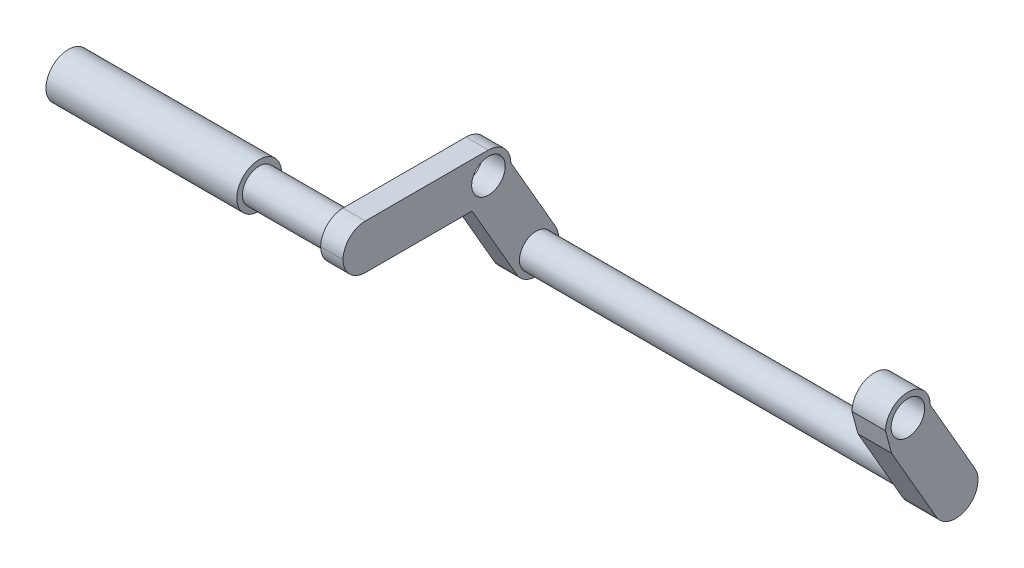
ISO-10303-21;
HEADER;
FILE_DESCRIPTION(('STEP AP214'),'2;1');
FILE_NAME('part.step','',(''),(''),'','','');
FILE_SCHEMA(('AUTOMOTIVE_DESIGN { 1 0 10303 214 1 1 1 1 }'));
ENDSEC;
DATA;
#1=APPLICATION_CONTEXT('core data for automotive mechanical design processes');
#2=APPLICATION_PROTOCOL_DEFINITION('international standard','automotive_design',2000,#1);
#3=PRODUCT_CONTEXT('',#1,'mechanical');
#4=PRODUCT('Part','Part','',(#3));
#5=PRODUCT_RELATED_PRODUCT_CATEGORY('part','',(#4));
#6=PRODUCT_DEFINITION_FORMATION('','',#4);
#7=PRODUCT_DEFINITION_CONTEXT('part definition',#1,'design');
#8=PRODUCT_DEFINITION('design','',#6,#7);
#9=PRODUCT_DEFINITION_SHAPE('','',#8);
#10=(LENGTH_UNIT() NAMED_UNIT(*) SI_UNIT(.MILLI.,.METRE.));
#11=(NAMED_UNIT(*) PLANE_ANGLE_UNIT() SI_UNIT($,.RADIAN.));
#12=(NAMED_UNIT(*) SI_UNIT($,.STERADIAN.) SOLID_ANGLE_UNIT());
#13=UNCERTAINTY_MEASURE_WITH_UNIT(LENGTH_MEASURE(1.E-05),#10,'distance_accuracy_value','');
#14=(GEOMETRIC_REPRESENTATION_CONTEXT(3) GLOBAL_UNCERTAINTY_ASSIGNED_CONTEXT((#13)) GLOBAL_UNIT_ASSIGNED_CONTEXT((#10,
#11,#12)) REPRESENTATION_CONTEXT('',''));
#15=CARTESIAN_POINT('',(0.,0.,0.));
#16=DIRECTION('',(0.,0.,1.));
#17=DIRECTION('',(1.,0.,0.));
#18=AXIS2_PLACEMENT_3D('',#15,#16,#17);
#19=CARTESIAN_POINT('',(62.56,-7.92820323027553,-15.2679491924311));
#20=DIRECTION('',(-1.,0.,0.));
#21=DIRECTION('',(0.,0.,1.));
#22=AXIS2_PLACEMENT_3D('',#19,#20,#21);
#23=CYLINDRICAL_SURFACE('',#22,1.5);
#24=CARTESIAN_POINT('',(26.56,-7.92820323027553,-15.2679491924311));
#25=DIRECTION('',(1.,0.,0.));
#26=DIRECTION('',(0.,0.,-1.));
#27=AXIS2_PLACEMENT_3D('',#24,#25,#26);
#28=CIRCLE('',#27,1.5);
#29=CARTESIAN_POINT('',(26.56,-7.92820323027553,-16.7679491924311));
#30=VERTEX_POINT('',#29);
#31=EDGE_CURVE('E189',#30,#30,#28,.T.);
#32=ORIENTED_EDGE('',*,*,#31,.T.);
#33=EDGE_LOOP('',(#32));
#34=FACE_BOUND('',#33,.T.);
#35=CARTESIAN_POINT('',(61.06,-7.92820323027553,-15.2679491924311));
#36=DIRECTION('',(1.,0.,0.));
#37=DIRECTION('',(0.,0.,-1.));
#38=AXIS2_PLACEMENT_3D('',#35,#36,#37);
#39=CIRCLE('',#38,1.5);
#40=CARTESIAN_POINT('',(61.06,-7.92820323027553,-16.7679491924311));
#41=VERTEX_POINT('',#40);
#42=EDGE_CURVE('E11',#41,#41,#39,.T.);
#43=ORIENTED_EDGE('',*,*,#42,.F.);
#44=EDGE_LOOP('',(#43));
#45=FACE_BOUND('',#44,.T.);
#46=ADVANCED_FACE('F35',(#34,#45),#23,.T.);
#47=CARTESIAN_POINT('',(26.56,0.,0.));
#48=DIRECTION('',(-1.,0.,0.));
#49=DIRECTION('',(0.,0.,1.));
#50=AXIS2_PLACEMENT_3D('',#47,#48,#49);
#51=CYLINDRICAL_SURFACE('',#50,1.5);
#52=CARTESIAN_POINT('',(17.06,0.,0.));
#53=DIRECTION('',(1.,0.,0.));
#54=DIRECTION('',(0.,0.,-1.));
#55=AXIS2_PLACEMENT_3D('',#52,#53,#54);
#56=CIRCLE('',#55,1.5);
#57=CARTESIAN_POINT('',(17.06,0.,-1.5));
#58=VERTEX_POINT('',#57);
#59=EDGE_CURVE('E229',#58,#58,#56,.T.);
#60=ORIENTED_EDGE('',*,*,#59,.T.);
#61=EDGE_LOOP('',(#60));
#62=FACE_BOUND('',#61,.T.);
#63=CARTESIAN_POINT('',(24.56,0.,0.));
#64=DIRECTION('',(1.,0.,0.));
#65=DIRECTION('',(0.,0.,-1.));
#66=AXIS2_PLACEMENT_3D('',#63,#64,#65);
#67=CIRCLE('',#66,1.5);
#68=CARTESIAN_POINT('',(24.56,0.,-1.5));
#69=VERTEX_POINT('',#68);
#70=EDGE_CURVE('E232',#69,#69,#67,.T.);
#71=ORIENTED_EDGE('',*,*,#70,.F.);
#72=EDGE_LOOP('',(#71));
#73=FACE_BOUND('',#72,.T.);
#74=ADVANCED_FACE('F324',(#62,#73),#51,.T.);
#75=CARTESIAN_POINT('',(17.06,0.,0.));
#76=DIRECTION('',(-1.,0.,0.));
#77=DIRECTION('',(0.,0.,1.));
#78=AXIS2_PLACEMENT_3D('',#75,#76,#77);
#79=CYLINDRICAL_SURFACE('',#78,2.);
#80=CARTESIAN_POINT('',(17.06,0.,0.));
#81=DIRECTION('',(1.,0.,0.));
#82=DIRECTION('',(0.,0.,-1.));
#83=AXIS2_PLACEMENT_3D('',#80,#81,#82);
#84=CIRCLE('',#83,2.);
#85=CARTESIAN_POINT('',(17.06,0.,-2.));
#86=VERTEX_POINT('',#85);
#87=EDGE_CURVE('E233',#86,#86,#84,.T.);
#88=ORIENTED_EDGE('',*,*,#87,.F.);
#89=EDGE_LOOP('',(#88));
#90=FACE_BOUND('',#89,.T.);
#91=CARTESIAN_POINT('',(0.,0.,0.));
#92=DIRECTION('',(1.,0.,0.));
#93=DIRECTION('',(0.,0.,-1.));
#94=AXIS2_PLACEMENT_3D('',#91,#92,#93);
#95=CIRCLE('',#94,2.);
#96=CARTESIAN_POINT('',(0.,0.,-2.));
#97=VERTEX_POINT('',#96);
#98=EDGE_CURVE('E224',#97,#97,#95,.T.);
#99=ORIENTED_EDGE('',*,*,#98,.T.);
#100=EDGE_LOOP('',(#99));
#101=FACE_BOUND('',#100,.T.);
#102=ADVANCED_FACE('F329',(#90,#101),#79,.T.);
#103=CARTESIAN_POINT('',(17.06,0.,0.));
#104=DIRECTION('',(1.,0.,0.));
#105=DIRECTION('',(0.,0.,-1.));
#106=AXIS2_PLACEMENT_3D('',#103,#104,#105);
#107=PLANE('',#106);
#108=ORIENTED_EDGE('',*,*,#59,.F.);
#109=EDGE_LOOP('',(#108));
#110=FACE_BOUND('',#109,.T.);
#111=ORIENTED_EDGE('',*,*,#87,.T.);
#112=EDGE_LOOP('',(#111));
#113=FACE_BOUND('',#112,.T.);
#114=ADVANCED_FACE('F489',(#110,#113),#107,.T.);
#115=CARTESIAN_POINT('',(0.,0.,0.));
#116=DIRECTION('',(1.,0.,0.));
#117=DIRECTION('',(0.,0.,-1.));
#118=AXIS2_PLACEMENT_3D('',#115,#116,#117);
#119=PLANE('',#118);
#120=ORIENTED_EDGE('',*,*,#98,.F.);
#121=EDGE_LOOP('',(#120));
#122=FACE_BOUND('',#121,.T.);
#123=ADVANCED_FACE('F458',(#122),#119,.F.);
#124=CARTESIAN_POINT('',(24.56,2.,2.));
#125=DIRECTION('',(0.,1.,0.));
#126=DIRECTION('',(0.,0.,1.));
#127=AXIS2_PLACEMENT_3D('',#124,#125,#126);
#128=PLANE('',#127);
#129=DIRECTION('',(0.,0.,1.));
#130=VECTOR('',#129,1.);
#131=CARTESIAN_POINT('',(26.56,2.,2.));
#132=LINE('',#131,#130);
#133=CARTESIAN_POINT('',(26.56,2.,-11.));
#134=VERTEX_POINT('',#133);
#135=CARTESIAN_POINT('',(26.56,2.,0.));
#136=VERTEX_POINT('',#135);
#137=EDGE_CURVE('E222',#134,#136,#132,.T.);
#138=ORIENTED_EDGE('',*,*,#137,.F.);
#139=DIRECTION('',(-1.,0.,0.));
#140=VECTOR('',#139,1.);
#141=CARTESIAN_POINT('',(24.56,2.,-11.));
#142=LINE('',#141,#140);
#143=CARTESIAN_POINT('',(24.56,2.,-11.));
#144=VERTEX_POINT('',#143);
#145=EDGE_CURVE('E263',#134,#144,#142,.T.);
#146=ORIENTED_EDGE('',*,*,#145,.T.);
#147=DIRECTION('',(0.,0.,1.));
#148=VECTOR('',#147,1.);
#149=CARTESIAN_POINT('',(24.56,2.,2.));
#150=LINE('',#149,#148);
#151=CARTESIAN_POINT('',(24.56,2.,0.));
#152=VERTEX_POINT('',#151);
#153=EDGE_CURVE('E221',#144,#152,#150,.T.);
#154=ORIENTED_EDGE('',*,*,#153,.T.);
#155=DIRECTION('',(1.,0.,0.));
#156=VECTOR('',#155,1.);
#157=CARTESIAN_POINT('',(24.56,2.,0.));
#158=LINE('',#157,#156);
#159=EDGE_CURVE('E240',#152,#136,#158,.T.);
#160=ORIENTED_EDGE('',*,*,#159,.T.);
#161=EDGE_LOOP('',(#138,#146,#154,#160));
#162=FACE_BOUND('',#161,.T.);
#163=ADVANCED_FACE('F305',(#162),#128,.T.);
#164=CARTESIAN_POINT('',(24.56,-2.,2.));
#165=DIRECTION('',(0.,-1.,0.));
#166=DIRECTION('',(0.,0.,-1.));
#167=AXIS2_PLACEMENT_3D('',#164,#165,#166);
#168=PLANE('',#167);
#169=DIRECTION('',(1.,0.,0.));
#170=VECTOR('',#169,1.);
#171=CARTESIAN_POINT('',(24.56,-2.,-9.53589838486225));
#172=LINE('',#171,#170);
#173=CARTESIAN_POINT('',(24.56,-2.,-9.53589838486225));
#174=VERTEX_POINT('',#173);
#175=CARTESIAN_POINT('',(26.56,-2.,-9.53589838486225));
#176=VERTEX_POINT('',#175);
#177=EDGE_CURVE('E204',#174,#176,#172,.T.);
#178=ORIENTED_EDGE('',*,*,#177,.T.);
#179=DIRECTION('',(0.,0.,-1.));
#180=VECTOR('',#179,1.);
#181=CARTESIAN_POINT('',(26.56,-2.,2.));
#182=LINE('',#181,#180);
#183=CARTESIAN_POINT('',(26.56,-2.,0.));
#184=VERTEX_POINT('',#183);
#185=EDGE_CURVE('E225',#184,#176,#182,.T.);
#186=ORIENTED_EDGE('',*,*,#185,.F.);
#187=DIRECTION('',(1.,0.,0.));
#188=VECTOR('',#187,1.);
#189=CARTESIAN_POINT('',(24.56,-2.,0.));
#190=LINE('',#189,#188);
#191=CARTESIAN_POINT('',(24.56,-2.,0.));
#192=VERTEX_POINT('',#191);
#193=EDGE_CURVE('E254',#184,#192,#190,.F.);
#194=ORIENTED_EDGE('',*,*,#193,.T.);
#195=DIRECTION('',(0.,0.,-1.));
#196=VECTOR('',#195,1.);
#197=CARTESIAN_POINT('',(24.56,-2.,2.));
#198=LINE('',#197,#196);
#199=EDGE_CURVE('E218',#192,#174,#198,.T.);
#200=ORIENTED_EDGE('',*,*,#199,.T.);
#201=EDGE_LOOP('',(#178,#186,#194,#200));
#202=FACE_BOUND('',#201,.T.);
#203=ADVANCED_FACE('F291',(#202),#168,.T.);
#204=CARTESIAN_POINT('',(24.56,0.,0.));
#205=DIRECTION('',(1.,0.,0.));
#206=DIRECTION('',(0.,0.,-1.));
#207=AXIS2_PLACEMENT_3D('',#204,#205,#206);
#208=PLANE('',#207);
#209=CARTESIAN_POINT('',(24.56,0.,-11.));
#210=DIRECTION('',(1.,0.,0.));
#211=DIRECTION('',(0.,0.,-1.));
#212=AXIS2_PLACEMENT_3D('',#209,#210,#211);
#213=CIRCLE('',#212,1.5);
#214=CARTESIAN_POINT('',(24.56,0.,-12.5));
#215=VERTEX_POINT('',#214);
#216=EDGE_CURVE('E214',#215,#215,#213,.T.);
#217=ORIENTED_EDGE('',*,*,#216,.T.);
#218=EDGE_LOOP('',(#217));
#219=FACE_BOUND('',#218,.T.);
#220=ORIENTED_EDGE('',*,*,#70,.T.);
#221=EDGE_LOOP('',(#220));
#222=FACE_BOUND('',#221,.T.);
#223=CARTESIAN_POINT('',(24.56,-7.92820323027553,-15.2679491924311));
#224=DIRECTION('',(1.,0.,0.));
#225=DIRECTION('',(0.,0.,-1.));
#226=AXIS2_PLACEMENT_3D('',#223,#224,#225);
#227=CIRCLE('',#226,2.);
#228=CARTESIAN_POINT('',(24.56,-6.92820323027553,-17.));
#229=VERTEX_POINT('',#228);
#230=CARTESIAN_POINT('',(24.56,-9.66025403784441,-16.2679491924311));
#231=VERTEX_POINT('',#230);
#232=EDGE_CURVE('E273',#229,#231,#227,.F.);
#233=ORIENTED_EDGE('',*,*,#232,.T.);
#234=CARTESIAN_POINT('',(24.56,-7.92820323027553,-15.2679491924311));
#235=DIRECTION('',(1.,0.,0.));
#236=DIRECTION('',(0.,0.,-1.));
#237=AXIS2_PLACEMENT_3D('',#234,#235,#236);
#238=CIRCLE('',#237,2.);
#239=CARTESIAN_POINT('',(24.56,-8.92820323027553,-13.5358983848622));
#240=VERTEX_POINT('',#239);
#241=EDGE_CURVE('E43',#231,#240,#238,.F.);
#242=ORIENTED_EDGE('',*,*,#241,.T.);
#243=DIRECTION('',(0.,-0.86602540378444,-0.499999999999998));
#244=VECTOR('',#243,1.);
#245=CARTESIAN_POINT('',(24.56,3.62916512459884,-6.28589838486227));
#246=LINE('',#245,#244);
#247=EDGE_CURVE('E198',#174,#240,#246,.T.);
#248=ORIENTED_EDGE('',*,*,#247,.F.);
#249=ORIENTED_EDGE('',*,*,#199,.F.);
#250=CARTESIAN_POINT('',(24.56,0.,0.));
#251=DIRECTION('',(1.,0.,0.));
#252=DIRECTION('',(0.,0.,-1.));
#253=AXIS2_PLACEMENT_3D('',#250,#251,#252);
#254=CIRCLE('',#253,2.);
#255=CARTESIAN_POINT('',(24.56,0.,2.));
#256=VERTEX_POINT('',#255);
#257=EDGE_CURVE('E256',#192,#256,#254,.F.);
#258=ORIENTED_EDGE('',*,*,#257,.T.);
#259=CARTESIAN_POINT('',(24.56,0.,0.));
#260=DIRECTION('',(1.,0.,0.));
#261=DIRECTION('',(0.,0.,-1.));
#262=AXIS2_PLACEMENT_3D('',#259,#260,#261);
#263=CIRCLE('',#262,2.);
#264=EDGE_CURVE('E249',#256,#152,#263,.F.);
#265=ORIENTED_EDGE('',*,*,#264,.T.);
#266=ORIENTED_EDGE('',*,*,#153,.F.);
#267=CARTESIAN_POINT('',(24.56,0.,-11.));
#268=DIRECTION('',(1.,0.,0.));
#269=DIRECTION('',(0.,0.,-1.));
#270=AXIS2_PLACEMENT_3D('',#267,#268,#269);
#271=CIRCLE('',#270,2.);
#272=CARTESIAN_POINT('',(24.56,0.,-13.));
#273=VERTEX_POINT('',#272);
#274=EDGE_CURVE('E260',#144,#273,#271,.F.);
#275=ORIENTED_EDGE('',*,*,#274,.T.);
#276=DIRECTION('',(0.,-0.86602540378444,-0.499999999999998));
#277=VECTOR('',#276,1.);
#278=CARTESIAN_POINT('',(24.56,5.62916512459884,-9.75000000000003));
#279=LINE('',#278,#277);
#280=EDGE_CURVE('E200',#273,#229,#279,.T.);
#281=ORIENTED_EDGE('',*,*,#280,.T.);
#282=EDGE_LOOP('',(#233,#242,#248,#249,#258,#265,#266,#275,#281));
#283=FACE_BOUND('',#282,.T.);
#284=ADVANCED_FACE('F288',(#219,#222,#283),#208,.F.);
#285=CARTESIAN_POINT('',(26.56,0.,0.));
#286=DIRECTION('',(1.,0.,0.));
#287=DIRECTION('',(0.,0.,-1.));
#288=AXIS2_PLACEMENT_3D('',#285,#286,#287);
#289=PLANE('',#288);
#290=ORIENTED_EDGE('',*,*,#31,.F.);
#291=EDGE_LOOP('',(#290));
#292=FACE_BOUND('',#291,.T.);
#293=CARTESIAN_POINT('',(26.56,0.,-11.));
#294=DIRECTION('',(1.,0.,0.));
#295=DIRECTION('',(0.,0.,-1.));
#296=AXIS2_PLACEMENT_3D('',#293,#294,#295);
#297=CIRCLE('',#296,1.5);
#298=CARTESIAN_POINT('',(26.56,0.,-12.5));
#299=VERTEX_POINT('',#298);
#300=EDGE_CURVE('E211',#299,#299,#297,.T.);
#301=ORIENTED_EDGE('',*,*,#300,.F.);
#302=EDGE_LOOP('',(#301));
#303=FACE_BOUND('',#302,.T.);
#304=DIRECTION('',(0.,-0.86602540378444,-0.499999999999998));
#305=VECTOR('',#304,1.);
#306=CARTESIAN_POINT('',(26.56,3.62916512459884,-6.28589838486227));
#307=LINE('',#306,#305);
#308=CARTESIAN_POINT('',(26.56,-8.92820323027553,-13.5358983848622));
#309=VERTEX_POINT('',#308);
#310=EDGE_CURVE('E197',#176,#309,#307,.T.);
#311=ORIENTED_EDGE('',*,*,#310,.T.);
#312=CARTESIAN_POINT('',(26.56,-7.92820323027553,-15.2679491924311));
#313=DIRECTION('',(1.,0.,0.));
#314=DIRECTION('',(0.,0.,-1.));
#315=AXIS2_PLACEMENT_3D('',#312,#313,#314);
#316=CIRCLE('',#315,2.);
#317=CARTESIAN_POINT('',(26.56,-9.66025403784441,-16.2679491924311));
#318=VERTEX_POINT('',#317);
#319=EDGE_CURVE('E57',#309,#318,#316,.T.);
#320=ORIENTED_EDGE('',*,*,#319,.T.);
#321=CARTESIAN_POINT('',(26.56,-7.92820323027553,-15.2679491924311));
#322=DIRECTION('',(1.,0.,0.));
#323=DIRECTION('',(0.,0.,-1.));
#324=AXIS2_PLACEMENT_3D('',#321,#322,#323);
#325=CIRCLE('',#324,2.);
#326=CARTESIAN_POINT('',(26.56,-6.92820323027553,-17.));
#327=VERTEX_POINT('',#326);
#328=EDGE_CURVE('E269',#318,#327,#325,.T.);
#329=ORIENTED_EDGE('',*,*,#328,.T.);
#330=DIRECTION('',(0.,-0.86602540378444,-0.499999999999998));
#331=VECTOR('',#330,1.);
#332=CARTESIAN_POINT('',(26.56,5.62916512459884,-9.75000000000003));
#333=LINE('',#332,#331);
#334=CARTESIAN_POINT('',(26.56,0.,-13.));
#335=VERTEX_POINT('',#334);
#336=EDGE_CURVE('E201',#335,#327,#333,.T.);
#337=ORIENTED_EDGE('',*,*,#336,.F.);
#338=CARTESIAN_POINT('',(26.56,0.,-11.));
#339=DIRECTION('',(1.,0.,0.));
#340=DIRECTION('',(0.,0.,-1.));
#341=AXIS2_PLACEMENT_3D('',#338,#339,#340);
#342=CIRCLE('',#341,2.);
#343=EDGE_CURVE('E258',#335,#134,#342,.T.);
#344=ORIENTED_EDGE('',*,*,#343,.T.);
#345=ORIENTED_EDGE('',*,*,#137,.T.);
#346=CARTESIAN_POINT('',(26.56,0.,0.));
#347=DIRECTION('',(1.,0.,0.));
#348=DIRECTION('',(0.,0.,-1.));
#349=AXIS2_PLACEMENT_3D('',#346,#347,#348);
#350=CIRCLE('',#349,2.);
#351=CARTESIAN_POINT('',(26.56,0.,2.));
#352=VERTEX_POINT('',#351);
#353=EDGE_CURVE('E243',#136,#352,#350,.T.);
#354=ORIENTED_EDGE('',*,*,#353,.T.);
#355=CARTESIAN_POINT('',(26.56,0.,0.));
#356=DIRECTION('',(1.,0.,0.));
#357=DIRECTION('',(0.,0.,-1.));
#358=AXIS2_PLACEMENT_3D('',#355,#356,#357);
#359=CIRCLE('',#358,2.);
#360=EDGE_CURVE('E252',#352,#184,#359,.T.);
#361=ORIENTED_EDGE('',*,*,#360,.T.);
#362=ORIENTED_EDGE('',*,*,#185,.T.);
#363=EDGE_LOOP('',(#311,#320,#329,#337,#344,#345,#354,#361,#362));
#364=FACE_BOUND('',#363,.T.);
#365=ADVANCED_FACE('F279',(#292,#303,#364),#289,.T.);
#366=CARTESIAN_POINT('',(24.56,0.,0.));
#367=DIRECTION('',(1.,0.,0.));
#368=DIRECTION('',(0.,0.,-1.));
#369=AXIS2_PLACEMENT_3D('',#366,#367,#368);
#370=CYLINDRICAL_SURFACE('',#369,2.);
#371=ORIENTED_EDGE('',*,*,#264,.F.);
#372=DIRECTION('',(1.,0.,0.));
#373=VECTOR('',#372,1.);
#374=CARTESIAN_POINT('',(24.56,0.,2.));
#375=LINE('',#374,#373);
#376=EDGE_CURVE('E246',#352,#256,#375,.F.);
#377=ORIENTED_EDGE('',*,*,#376,.F.);
#378=ORIENTED_EDGE('',*,*,#353,.F.);
#379=ORIENTED_EDGE('',*,*,#159,.F.);
#380=EDGE_LOOP('',(#371,#377,#378,#379));
#381=FACE_BOUND('',#380,.T.);
#382=ADVANCED_FACE('F301',(#381),#370,.T.);
#383=CARTESIAN_POINT('',(24.56,0.,0.));
#384=DIRECTION('',(1.,0.,0.));
#385=DIRECTION('',(0.,0.,-1.));
#386=AXIS2_PLACEMENT_3D('',#383,#384,#385);
#387=CYLINDRICAL_SURFACE('',#386,2.);
#388=ORIENTED_EDGE('',*,*,#257,.F.);
#389=ORIENTED_EDGE('',*,*,#193,.F.);
#390=ORIENTED_EDGE('',*,*,#360,.F.);
#391=ORIENTED_EDGE('',*,*,#376,.T.);
#392=EDGE_LOOP('',(#388,#389,#390,#391));
#393=FACE_BOUND('',#392,.T.);
#394=ADVANCED_FACE('F295',(#393),#387,.T.);
#395=CARTESIAN_POINT('',(24.56,0.,-11.));
#396=DIRECTION('',(-1.,0.,0.));
#397=DIRECTION('',(0.,0.,1.));
#398=AXIS2_PLACEMENT_3D('',#395,#396,#397);
#399=CYLINDRICAL_SURFACE('',#398,2.);
#400=DIRECTION('',(-1.,0.,0.));
#401=VECTOR('',#400,1.);
#402=CARTESIAN_POINT('',(0.,0.,-13.));
#403=LINE('',#402,#401);
#404=EDGE_CURVE('E217',#273,#335,#403,.F.);
#405=ORIENTED_EDGE('',*,*,#404,.F.);
#406=ORIENTED_EDGE('',*,*,#274,.F.);
#407=ORIENTED_EDGE('',*,*,#145,.F.);
#408=ORIENTED_EDGE('',*,*,#343,.F.);
#409=EDGE_LOOP('',(#405,#406,#407,#408));
#410=FACE_BOUND('',#409,.T.);
#411=ADVANCED_FACE('F310',(#410),#399,.T.);
#412=CARTESIAN_POINT('',(0.,0.,-11.));
#413=DIRECTION('',(1.,0.,0.));
#414=DIRECTION('',(0.,0.,-1.));
#415=AXIS2_PLACEMENT_3D('',#412,#413,#414);
#416=CYLINDRICAL_SURFACE('',#415,1.5);
#417=CARTESIAN_POINT('',(26.56,0.,-12.5));
#418=CARTESIAN_POINT('',(26.5391666666667,0.,-12.5));
#419=CARTESIAN_POINT('',(26.5183333333333,0.,-12.5));
#420=CARTESIAN_POINT('',(26.4766666666667,0.,-12.5));
#421=CARTESIAN_POINT('',(26.4558333333333,0.,-12.5));
#422=CARTESIAN_POINT('',(26.4141666666667,0.,-12.5));
#423=CARTESIAN_POINT('',(26.3933333333333,0.,-12.5));
#424=CARTESIAN_POINT('',(26.3516666666667,0.,-12.5));
#425=CARTESIAN_POINT('',(26.3308333333333,0.,-12.5));
#426=CARTESIAN_POINT('',(26.2891666666667,0.,-12.5));
#427=CARTESIAN_POINT('',(26.2683333333333,0.,-12.5));
#428=CARTESIAN_POINT('',(26.2266666666667,0.,-12.5));
#429=CARTESIAN_POINT('',(26.2058333333333,0.,-12.5));
#430=CARTESIAN_POINT('',(26.1641666666667,0.,-12.5));
#431=CARTESIAN_POINT('',(26.1433333333333,0.,-12.5));
#432=CARTESIAN_POINT('',(26.1016666666667,0.,-12.5));
#433=CARTESIAN_POINT('',(26.0808333333333,0.,-12.5));
#434=CARTESIAN_POINT('',(26.0391666666667,0.,-12.5));
#435=CARTESIAN_POINT('',(26.0183333333333,0.,-12.5));
#436=CARTESIAN_POINT('',(25.9766666666667,0.,-12.5));
#437=CARTESIAN_POINT('',(25.9558333333333,0.,-12.5));
#438=CARTESIAN_POINT('',(25.9141666666667,0.,-12.5));
#439=CARTESIAN_POINT('',(25.8933333333333,0.,-12.5));
#440=CARTESIAN_POINT('',(25.8516666666667,0.,-12.5));
#441=CARTESIAN_POINT('',(25.8308333333333,0.,-12.5));
#442=CARTESIAN_POINT('',(25.7891666666667,0.,-12.5));
#443=CARTESIAN_POINT('',(25.7683333333333,0.,-12.5));
#444=CARTESIAN_POINT('',(25.7266666666667,0.,-12.5));
#445=CARTESIAN_POINT('',(25.7058333333333,0.,-12.5));
#446=CARTESIAN_POINT('',(25.6641666666667,0.,-12.5));
#447=CARTESIAN_POINT('',(25.6433333333333,0.,-12.5));
#448=CARTESIAN_POINT('',(25.6016666666667,0.,-12.5));
#449=CARTESIAN_POINT('',(25.5808333333333,0.,-12.5));
#450=CARTESIAN_POINT('',(25.5391666666667,0.,-12.5));
#451=CARTESIAN_POINT('',(25.5183333333333,0.,-12.5));
#452=CARTESIAN_POINT('',(25.4766666666667,0.,-12.5));
#453=CARTESIAN_POINT('',(25.4558333333333,0.,-12.5));
#454=CARTESIAN_POINT('',(25.4141666666667,0.,-12.5));
#455=CARTESIAN_POINT('',(25.3933333333333,0.,-12.5));
#456=CARTESIAN_POINT('',(25.3516666666667,0.,-12.5));
#457=CARTESIAN_POINT('',(25.3308333333333,0.,-12.5));
#458=CARTESIAN_POINT('',(25.2891666666667,0.,-12.5));
#459=CARTESIAN_POINT('',(25.2683333333333,0.,-12.5));
#460=CARTESIAN_POINT('',(25.2266666666667,0.,-12.5));
#461=CARTESIAN_POINT('',(25.2058333333333,0.,-12.5));
#462=CARTESIAN_POINT('',(25.1641666666667,0.,-12.5));
#463=CARTESIAN_POINT('',(25.1433333333333,0.,-12.5));
#464=CARTESIAN_POINT('',(25.1016666666667,0.,-12.5));
#465=CARTESIAN_POINT('',(25.0808333333333,0.,-12.5));
#466=CARTESIAN_POINT('',(25.0391666666667,0.,-12.5));
#467=CARTESIAN_POINT('',(25.0183333333333,0.,-12.5));
#468=CARTESIAN_POINT('',(24.9766666666667,0.,-12.5));
#469=CARTESIAN_POINT('',(24.9558333333333,0.,-12.5));
#470=CARTESIAN_POINT('',(24.9141666666667,0.,-12.5));
#471=CARTESIAN_POINT('',(24.8933333333333,0.,-12.5));
#472=CARTESIAN_POINT('',(24.8516666666667,0.,-12.5));
#473=CARTESIAN_POINT('',(24.8308333333333,0.,-12.5));
#474=CARTESIAN_POINT('',(24.7891666666667,0.,-12.5));
#475=CARTESIAN_POINT('',(24.7683333333333,0.,-12.5));
#476=CARTESIAN_POINT('',(24.7266666666667,0.,-12.5));
#477=CARTESIAN_POINT('',(24.7058333333333,0.,-12.5));
#478=CARTESIAN_POINT('',(24.6641666666667,0.,-12.5));
#479=CARTESIAN_POINT('',(24.6433333333333,0.,-12.5));
#480=CARTESIAN_POINT('',(24.6016666666667,0.,-12.5));
#481=CARTESIAN_POINT('',(24.5808333333333,0.,-12.5));
#482=CARTESIAN_POINT('',(24.56,0.,-12.5));
#483=B_SPLINE_CURVE_WITH_KNOTS('',3,(#417,#418,#419,#420,#421,#422,#423,#424,#425,#426,#427,
#428,#429,#430,#431,#432,#433,#434,#435,#436,#437,#438,#439,#440,#441,#442,#443,#444,#445,#446,
#447,#448,#449,#450,#451,#452,#453,#454,#455,#456,#457,#458,#459,#460,#461,#462,#463,#464,#465,
#466,#467,#468,#469,#470,#471,#472,#473,#474,#475,#476,#477,#478,#479,#480,#481,#482),
.UNSPECIFIED.,.F.,.F.,(4,2,2,2,2,2,2,2,2,2,2,2,2,2,2,2,2,2,2,2,2,2,2,2,2,2,2,2,2,2,2,2,4),(0.,
0.0625000000000001,0.125,0.1875,0.25,0.3125,0.375,0.4375,0.5,0.5625,0.625000000000001,
0.687500000000001,0.750000000000001,0.812500000000001,0.875000000000001,0.937500000000001,1.,
1.0625,1.125,1.1875,1.25,1.3125,1.375,1.4375,1.5,1.5625,1.625,1.6875,1.75,1.8125,1.875,1.9375,
2.),.UNSPECIFIED.);
#484=EDGE_CURVE('BSEAM320',#299,#215,#483,.T.);
#485=ORIENTED_EDGE('',*,*,#300,.T.);
#486=ORIENTED_EDGE('',*,*,#216,.F.);
#487=ORIENTED_EDGE('',*,*,#484,.T.);
#488=ORIENTED_EDGE('',*,*,#484,.F.);
#489=EDGE_LOOP('',(#485,#487,#486,#488));
#490=FACE_BOUND('',#489,.T.);
#491=ADVANCED_FACE('F320',(#490),#416,.F.);
#492=CARTESIAN_POINT('',(24.56,3.62916512459884,-6.28589838486227));
#493=DIRECTION('',(0.,-0.499999999999998,0.86602540378444));
#494=DIRECTION('',(0.,-0.86602540378444,-0.499999999999998));
#495=AXIS2_PLACEMENT_3D('',#492,#493,#494);
#496=PLANE('',#495);
#497=ORIENTED_EDGE('',*,*,#247,.T.);
#498=DIRECTION('',(1.,0.,0.));
#499=VECTOR('',#498,1.);
#500=CARTESIAN_POINT('',(24.56,-8.92820323027552,-13.5358983848622));
#501=LINE('',#500,#499);
#502=EDGE_CURVE('E275',#240,#309,#501,.T.);
#503=ORIENTED_EDGE('',*,*,#502,.T.);
#504=ORIENTED_EDGE('',*,*,#310,.F.);
#505=ORIENTED_EDGE('',*,*,#177,.F.);
#506=EDGE_LOOP('',(#497,#503,#504,#505));
#507=FACE_BOUND('',#506,.T.);
#508=ADVANCED_FACE('F286',(#507),#496,.T.);
#509=CARTESIAN_POINT('',(24.56,5.62916512459884,-9.75000000000003));
#510=DIRECTION('',(0.,-0.499999999999998,0.86602540378444));
#511=DIRECTION('',(0.,-0.86602540378444,-0.499999999999998));
#512=AXIS2_PLACEMENT_3D('',#509,#510,#511);
#513=PLANE('',#512);
#514=ORIENTED_EDGE('',*,*,#336,.T.);
#515=DIRECTION('',(1.,0.,0.));
#516=VECTOR('',#515,1.);
#517=CARTESIAN_POINT('',(24.56,-6.92820323027553,-17.));
#518=LINE('',#517,#516);
#519=EDGE_CURVE('E271',#327,#229,#518,.F.);
#520=ORIENTED_EDGE('',*,*,#519,.T.);
#521=ORIENTED_EDGE('',*,*,#280,.F.);
#522=ORIENTED_EDGE('',*,*,#404,.T.);
#523=EDGE_LOOP('',(#514,#520,#521,#522));
#524=FACE_BOUND('',#523,.T.);
#525=ADVANCED_FACE('F313',(#524),#513,.F.);
#526=CARTESIAN_POINT('',(24.56,-7.92820323027553,-15.2679491924311));
#527=DIRECTION('',(-1.,0.,0.));
#528=DIRECTION('',(0.,0.,1.));
#529=AXIS2_PLACEMENT_3D('',#526,#527,#528);
#530=CYLINDRICAL_SURFACE('',#529,2.);
#531=ORIENTED_EDGE('',*,*,#232,.F.);
#532=ORIENTED_EDGE('',*,*,#519,.F.);
#533=ORIENTED_EDGE('',*,*,#328,.F.);
#534=DIRECTION('',(1.,0.,0.));
#535=VECTOR('',#534,1.);
#536=CARTESIAN_POINT('',(26.56,-9.66025403784441,-16.2679491924311));
#537=LINE('',#536,#535);
#538=EDGE_CURVE('E265',#231,#318,#537,.T.);
#539=ORIENTED_EDGE('',*,*,#538,.F.);
#540=EDGE_LOOP('',(#531,#532,#533,#539));
#541=FACE_BOUND('',#540,.T.);
#542=ADVANCED_FACE('F284',(#541),#530,.T.);
#543=CARTESIAN_POINT('',(24.56,-7.92820323027553,-15.2679491924311));
#544=DIRECTION('',(1.,0.,0.));
#545=DIRECTION('',(0.,0.,-1.));
#546=AXIS2_PLACEMENT_3D('',#543,#544,#545);
#547=CYLINDRICAL_SURFACE('',#546,2.);
#548=ORIENTED_EDGE('',*,*,#241,.F.);
#549=ORIENTED_EDGE('',*,*,#538,.T.);
#550=ORIENTED_EDGE('',*,*,#319,.F.);
#551=ORIENTED_EDGE('',*,*,#502,.F.);
#552=EDGE_LOOP('',(#548,#549,#550,#551));
#553=FACE_BOUND('',#552,.T.);
#554=ADVANCED_FACE('F37',(#553),#547,.T.);
#555=CARTESIAN_POINT('',(61.06,-7.92820323027553,-15.2679491924311));
#556=DIRECTION('',(1.,0.,0.));
#557=DIRECTION('',(0.,0.,-1.));
#558=AXIS2_PLACEMENT_3D('',#555,#556,#557);
#559=CYLINDRICAL_SURFACE('',#558,2.);
#560=DIRECTION('',(1.,0.,0.));
#561=VECTOR('',#560,1.);
#562=CARTESIAN_POINT('',(61.06,-6.92820323027553,-17.));
#563=LINE('',#562,#561);
#564=CARTESIAN_POINT('',(61.06,-6.92820323027553,-17.));
#565=VERTEX_POINT('',#564);
#566=CARTESIAN_POINT('',(64.06,-6.92820323027553,-17.));
#567=VERTEX_POINT('',#566);
#568=EDGE_CURVE('E137',#565,#567,#563,.T.);
#569=ORIENTED_EDGE('',*,*,#568,.T.);
#570=CARTESIAN_POINT('',(64.06,-7.92820323027553,-15.2679491924311));
#571=DIRECTION('',(1.,0.,0.));
#572=DIRECTION('',(0.,0.,-1.));
#573=AXIS2_PLACEMENT_3D('',#570,#571,#572);
#574=CIRCLE('',#573,2.);
#575=CARTESIAN_POINT('',(64.06,-8.92820323027553,-13.5358983848622));
#576=VERTEX_POINT('',#575);
#577=EDGE_CURVE('E141',#576,#567,#574,.T.);
#578=ORIENTED_EDGE('',*,*,#577,.F.);
#579=DIRECTION('',(1.,0.,0.));
#580=VECTOR('',#579,1.);
#581=CARTESIAN_POINT('',(61.06,-8.92820323027553,-13.5358983848622));
#582=LINE('',#581,#580);
#583=CARTESIAN_POINT('',(61.06,-8.92820323027553,-13.5358983848622));
#584=VERTEX_POINT('',#583);
#585=EDGE_CURVE('E187',#584,#576,#582,.T.);
#586=ORIENTED_EDGE('',*,*,#585,.F.);
#587=CARTESIAN_POINT('',(61.06,-7.92820323027553,-15.2679491924311));
#588=DIRECTION('',(1.,0.,0.));
#589=DIRECTION('',(0.,0.,-1.));
#590=AXIS2_PLACEMENT_3D('',#587,#588,#589);
#591=CIRCLE('',#590,2.);
#592=EDGE_CURVE('E143',#584,#565,#591,.T.);
#593=ORIENTED_EDGE('',*,*,#592,.T.);
#594=EDGE_LOOP('',(#569,#578,#586,#593));
#595=FACE_BOUND('',#594,.T.);
#596=ADVANCED_FACE('F139',(#595),#559,.T.);
#597=CARTESIAN_POINT('',(61.06,3.62916512459884,-6.28589838486227));
#598=DIRECTION('',(0.,-0.499999999999998,0.86602540378444));
#599=DIRECTION('',(0.,-0.86602540378444,-0.499999999999998));
#600=AXIS2_PLACEMENT_3D('',#597,#598,#599);
#601=PLANE('',#600);
#602=ORIENTED_EDGE('',*,*,#585,.T.);
#603=DIRECTION('',(0.,-0.86602540378444,-0.499999999999998));
#604=VECTOR('',#603,1.);
#605=CARTESIAN_POINT('',(64.06,3.62916512459884,-6.28589838486227));
#606=LINE('',#605,#604);
#607=CARTESIAN_POINT('',(64.06,-2.,-9.53589838486224));
#608=VERTEX_POINT('',#607);
#609=EDGE_CURVE('E163',#608,#576,#606,.T.);
#610=ORIENTED_EDGE('',*,*,#609,.F.);
#611=DIRECTION('',(1.,0.,0.));
#612=VECTOR('',#611,1.);
#613=CARTESIAN_POINT('',(61.06,-2.,-9.53589838486224));
#614=LINE('',#613,#612);
#615=CARTESIAN_POINT('',(61.06,-2.,-9.53589838486224));
#616=VERTEX_POINT('',#615);
#617=EDGE_CURVE('E190',#616,#608,#614,.T.);
#618=ORIENTED_EDGE('',*,*,#617,.F.);
#619=DIRECTION('',(0.,-0.86602540378444,-0.499999999999998));
#620=VECTOR('',#619,1.);
#621=CARTESIAN_POINT('',(61.06,3.62916512459884,-6.28589838486227));
#622=LINE('',#621,#620);
#623=EDGE_CURVE('E182',#616,#584,#622,.T.);
#624=ORIENTED_EDGE('',*,*,#623,.T.);
#625=EDGE_LOOP('',(#602,#610,#618,#624));
#626=FACE_BOUND('',#625,.T.);
#627=ADVANCED_FACE('F336',(#626),#601,.T.);
#628=CARTESIAN_POINT('',(61.06,2.25,-8.39711431702997));
#629=DIRECTION('',(0.,0.25881904510252,-0.965925826289068));
#630=DIRECTION('',(0.,0.965925826289069,0.258819045102521));
#631=AXIS2_PLACEMENT_3D('',#628,#629,#630);
#632=PLANE('',#631);
#633=ORIENTED_EDGE('',*,*,#617,.T.);
#634=DIRECTION('',(0.,0.965925826289068,0.25881904510252));
#635=VECTOR('',#634,1.);
#636=CARTESIAN_POINT('',(64.06,2.25,-8.39711431702997));
#637=LINE('',#636,#635);
#638=CARTESIAN_POINT('',(64.06,0.,-9.));
#639=VERTEX_POINT('',#638);
#640=EDGE_CURVE('E167',#608,#639,#637,.T.);
#641=ORIENTED_EDGE('',*,*,#640,.T.);
#642=DIRECTION('',(1.,0.,0.));
#643=VECTOR('',#642,1.);
#644=CARTESIAN_POINT('',(61.06,0.,-9.));
#645=LINE('',#644,#643);
#646=CARTESIAN_POINT('',(61.06,0.,-9.));
#647=VERTEX_POINT('',#646);
#648=EDGE_CURVE('E192',#647,#639,#645,.T.);
#649=ORIENTED_EDGE('',*,*,#648,.F.);
#650=DIRECTION('',(0.,0.965925826289068,0.25881904510252));
#651=VECTOR('',#650,1.);
#652=CARTESIAN_POINT('',(61.06,2.25,-8.39711431702997));
#653=LINE('',#652,#651);
#654=EDGE_CURVE('E180',#616,#647,#653,.T.);
#655=ORIENTED_EDGE('',*,*,#654,.F.);
#656=EDGE_LOOP('',(#633,#641,#649,#655));
#657=FACE_BOUND('',#656,.T.);
#658=ADVANCED_FACE('F343',(#657),#632,.F.);
#659=CARTESIAN_POINT('',(61.06,0.,-11.));
#660=DIRECTION('',(1.,0.,0.));
#661=DIRECTION('',(0.,0.,-1.));
#662=AXIS2_PLACEMENT_3D('',#659,#660,#661);
#663=CYLINDRICAL_SURFACE('',#662,2.);
#664=ORIENTED_EDGE('',*,*,#648,.T.);
#665=CARTESIAN_POINT('',(64.06,0.,-11.));
#666=DIRECTION('',(1.,0.,0.));
#667=DIRECTION('',(0.,0.,-1.));
#668=AXIS2_PLACEMENT_3D('',#665,#666,#667);
#669=CIRCLE('',#668,2.);
#670=CARTESIAN_POINT('',(64.06,0.,-13.));
#671=VERTEX_POINT('',#670);
#672=EDGE_CURVE('E156',#671,#639,#669,.T.);
#673=ORIENTED_EDGE('',*,*,#672,.F.);
#674=DIRECTION('',(1.,0.,0.));
#675=VECTOR('',#674,1.);
#676=CARTESIAN_POINT('',(61.06,0.,-13.));
#677=LINE('',#676,#675);
#678=CARTESIAN_POINT('',(61.06,0.,-13.));
#679=VERTEX_POINT('',#678);
#680=EDGE_CURVE('E147',#679,#671,#677,.T.);
#681=ORIENTED_EDGE('',*,*,#680,.F.);
#682=CARTESIAN_POINT('',(61.06,0.,-11.));
#683=DIRECTION('',(1.,0.,0.));
#684=DIRECTION('',(0.,0.,-1.));
#685=AXIS2_PLACEMENT_3D('',#682,#683,#684);
#686=CIRCLE('',#685,2.);
#687=EDGE_CURVE('E177',#679,#647,#686,.T.);
#688=ORIENTED_EDGE('',*,*,#687,.T.);
#689=EDGE_LOOP('',(#664,#673,#681,#688));
#690=FACE_BOUND('',#689,.T.);
#691=ADVANCED_FACE('F340',(#690),#663,.T.);
#692=CARTESIAN_POINT('',(61.06,5.62916512459883,-9.75000000000003));
#693=DIRECTION('',(0.,0.499999999999998,-0.86602540378444));
#694=DIRECTION('',(0.,0.86602540378444,0.499999999999998));
#695=AXIS2_PLACEMENT_3D('',#692,#693,#694);
#696=PLANE('',#695);
#697=ORIENTED_EDGE('',*,*,#680,.T.);
#698=DIRECTION('',(0.,0.86602540378444,0.499999999999998));
#699=VECTOR('',#698,1.);
#700=CARTESIAN_POINT('',(64.06,5.62916512459883,-9.75000000000003));
#701=LINE('',#700,#699);
#702=EDGE_CURVE('E151',#567,#671,#701,.T.);
#703=ORIENTED_EDGE('',*,*,#702,.F.);
#704=ORIENTED_EDGE('',*,*,#568,.F.);
#705=DIRECTION('',(0.,0.86602540378444,0.499999999999998));
#706=VECTOR('',#705,1.);
#707=CARTESIAN_POINT('',(61.06,5.62916512459883,-9.75000000000003));
#708=LINE('',#707,#706);
#709=EDGE_CURVE('E175',#565,#679,#708,.T.);
#710=ORIENTED_EDGE('',*,*,#709,.T.);
#711=EDGE_LOOP('',(#697,#703,#704,#710));
#712=FACE_BOUND('',#711,.T.);
#713=ADVANCED_FACE('F152',(#712),#696,.T.);
#714=CARTESIAN_POINT('',(61.06,0.,-11.));
#715=DIRECTION('',(1.,0.,0.));
#716=DIRECTION('',(0.,0.,-1.));
#717=AXIS2_PLACEMENT_3D('',#714,#715,#716);
#718=CYLINDRICAL_SURFACE('',#717,1.5);
#719=CARTESIAN_POINT('',(61.06,0.,-11.));
#720=DIRECTION('',(1.,0.,0.));
#721=DIRECTION('',(0.,0.,-1.));
#722=AXIS2_PLACEMENT_3D('',#719,#720,#721);
#723=CIRCLE('',#722,1.5);
#724=CARTESIAN_POINT('',(61.06,0.,-12.5));
#725=VERTEX_POINT('',#724);
#726=EDGE_CURVE('E148',#725,#725,#723,.T.);
#727=ORIENTED_EDGE('',*,*,#726,.F.);
#728=EDGE_LOOP('',(#727));
#729=FACE_BOUND('',#728,.T.);
#730=CARTESIAN_POINT('',(64.06,0.,-11.));
#731=DIRECTION('',(1.,0.,0.));
#732=DIRECTION('',(0.,0.,-1.));
#733=AXIS2_PLACEMENT_3D('',#730,#731,#732);
#734=CIRCLE('',#733,1.5);
#735=CARTESIAN_POINT('',(64.06,0.,-12.5));
#736=VERTEX_POINT('',#735);
#737=EDGE_CURVE('E171',#736,#736,#734,.T.);
#738=ORIENTED_EDGE('',*,*,#737,.T.);
#739=EDGE_LOOP('',(#738));
#740=FACE_BOUND('',#739,.T.);
#741=ADVANCED_FACE('F339',(#729,#740),#718,.F.);
#742=CARTESIAN_POINT('',(61.06,0.,0.));
#743=DIRECTION('',(1.,0.,0.));
#744=DIRECTION('',(0.,0.,-1.));
#745=AXIS2_PLACEMENT_3D('',#742,#743,#744);
#746=PLANE('',#745);
#747=ORIENTED_EDGE('',*,*,#42,.T.);
#748=EDGE_LOOP('',(#747));
#749=FACE_BOUND('',#748,.T.);
#750=ORIENTED_EDGE('',*,*,#592,.F.);
#751=ORIENTED_EDGE('',*,*,#623,.F.);
#752=ORIENTED_EDGE('',*,*,#654,.T.);
#753=ORIENTED_EDGE('',*,*,#687,.F.);
#754=ORIENTED_EDGE('',*,*,#709,.F.);
#755=EDGE_LOOP('',(#750,#751,#752,#753,#754));
#756=FACE_BOUND('',#755,.T.);
#757=ORIENTED_EDGE('',*,*,#726,.T.);
#758=EDGE_LOOP('',(#757));
#759=FACE_BOUND('',#758,.T.);
#760=ADVANCED_FACE('F353',(#749,#756,#759),#746,.F.);
#761=CARTESIAN_POINT('',(64.06,0.,0.));
#762=DIRECTION('',(1.,0.,0.));
#763=DIRECTION('',(0.,0.,-1.));
#764=AXIS2_PLACEMENT_3D('',#761,#762,#763);
#765=PLANE('',#764);
#766=ORIENTED_EDGE('',*,*,#577,.T.);
#767=ORIENTED_EDGE('',*,*,#702,.T.);
#768=ORIENTED_EDGE('',*,*,#672,.T.);
#769=ORIENTED_EDGE('',*,*,#640,.F.);
#770=ORIENTED_EDGE('',*,*,#609,.T.);
#771=EDGE_LOOP('',(#766,#767,#768,#769,#770));
#772=FACE_BOUND('',#771,.T.);
#773=ORIENTED_EDGE('',*,*,#737,.F.);
#774=EDGE_LOOP('',(#773));
#775=FACE_BOUND('',#774,.T.);
#776=ADVANCED_FACE('F159',(#772,#775),#765,.T.);
#777=CLOSED_SHELL('',(#46,#74,#102,#114,#123,#163,#203,#284,#365,#382,#394,#411,#491,#508,#525,
#542,#554,#596,#627,#658,#691,#713,#741,#760,#776));
#778=MANIFOLD_SOLID_BREP('B2',#777);
#779=ADVANCED_BREP_SHAPE_REPRESENTATION('',(#18,#778),#14);
#780=SHAPE_DEFINITION_REPRESENTATION(#9,#779);
ENDSEC;
END-ISO-10303-21;
